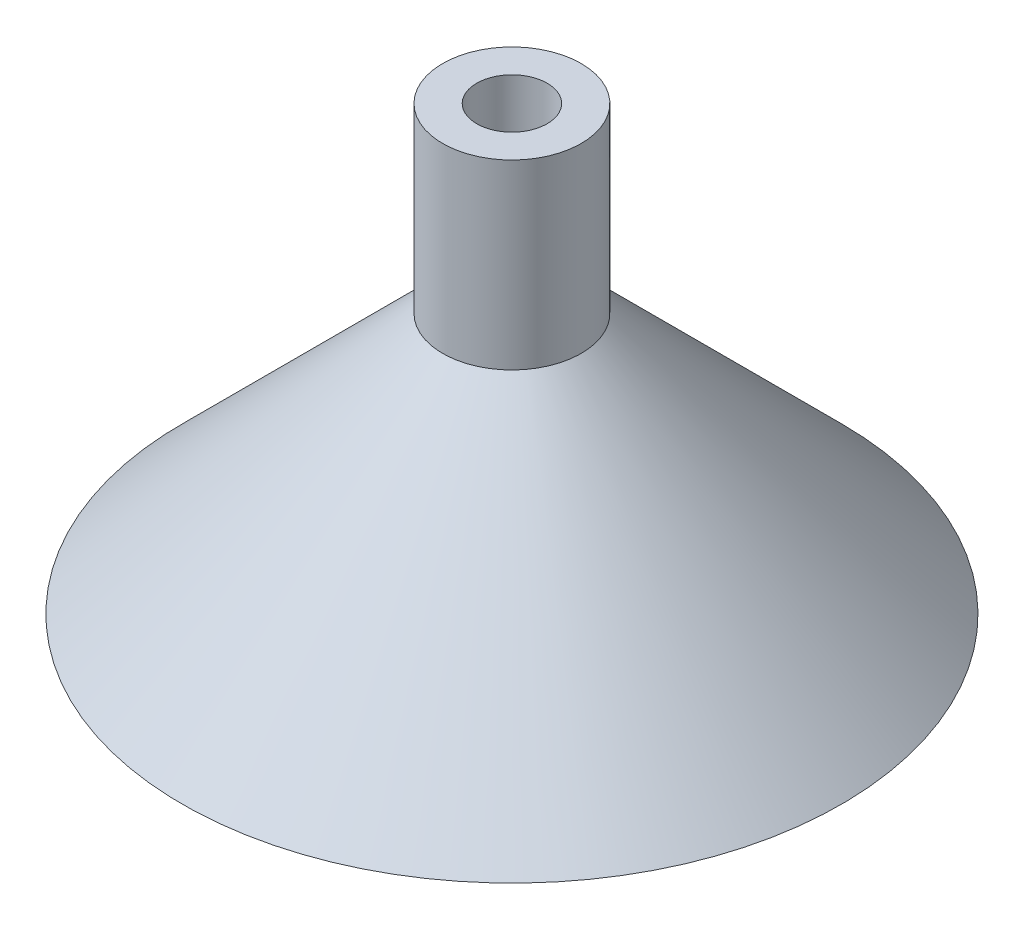
ISO-10303-21;
HEADER;
FILE_DESCRIPTION(('STEP AP214'),'2;1');
FILE_NAME('part.step','',(''),(''),'','','');
FILE_SCHEMA(('AUTOMOTIVE_DESIGN { 1 0 10303 214 1 1 1 1 }'));
ENDSEC;
DATA;
#1=APPLICATION_CONTEXT('core data for automotive mechanical design processes');
#2=APPLICATION_PROTOCOL_DEFINITION('international standard','automotive_design',2000,#1);
#3=PRODUCT_CONTEXT('',#1,'mechanical');
#4=PRODUCT('Part','Part','',(#3));
#5=PRODUCT_RELATED_PRODUCT_CATEGORY('part','',(#4));
#6=PRODUCT_DEFINITION_FORMATION('','',#4);
#7=PRODUCT_DEFINITION_CONTEXT('part definition',#1,'design');
#8=PRODUCT_DEFINITION('design','',#6,#7);
#9=PRODUCT_DEFINITION_SHAPE('','',#8);
#10=(LENGTH_UNIT() NAMED_UNIT(*) SI_UNIT(.MILLI.,.METRE.));
#11=(NAMED_UNIT(*) PLANE_ANGLE_UNIT() SI_UNIT($,.RADIAN.));
#12=(NAMED_UNIT(*) SI_UNIT($,.STERADIAN.) SOLID_ANGLE_UNIT());
#13=UNCERTAINTY_MEASURE_WITH_UNIT(LENGTH_MEASURE(1.E-05),#10,'distance_accuracy_value','');
#14=(GEOMETRIC_REPRESENTATION_CONTEXT(3) GLOBAL_UNCERTAINTY_ASSIGNED_CONTEXT((#13)) GLOBAL_UNIT_ASSIGNED_CONTEXT((#10,
#11,#12)) REPRESENTATION_CONTEXT('',''));
#15=CARTESIAN_POINT('',(0.,0.,0.));
#16=DIRECTION('',(0.,0.,1.));
#17=DIRECTION('',(1.,0.,0.));
#18=AXIS2_PLACEMENT_3D('',#15,#16,#17);
#19=CARTESIAN_POINT('',(0.,0.,0.));
#20=DIRECTION('',(0.,-1.,0.));
#21=DIRECTION('',(0.,0.,-1.));
#22=AXIS2_PLACEMENT_3D('',#19,#20,#21);
#23=CONICAL_SURFACE('',#22,29.,0.785398163397443);
#24=CARTESIAN_POINT('',(0.,22.9040000000002,0.));
#25=DIRECTION('',(0.,-1.,0.));
#26=DIRECTION('',(0.,0.,-1.));
#27=AXIS2_PLACEMENT_3D('',#24,#25,#26);
#28=CIRCLE('',#27,6.096);
#29=CARTESIAN_POINT('',(0.,22.9040000000002,-6.096));
#30=VERTEX_POINT('',#29);
#31=EDGE_CURVE('E53',#30,#30,#28,.T.);
#32=CARTESIAN_POINT('',(0.,0.,0.));
#33=DIRECTION('',(0.,-1.,0.));
#34=DIRECTION('',(0.,0.,-1.));
#35=AXIS2_PLACEMENT_3D('',#32,#33,#34);
#36=CIRCLE('',#35,29.);
#37=CARTESIAN_POINT('',(0.,0.,-29.));
#38=VERTEX_POINT('',#37);
#39=EDGE_CURVE('E10',#38,#38,#36,.T.);
#40=CARTESIAN_POINT('',(0.,22.9040000000002,-6.096));
#41=CARTESIAN_POINT('',(0.,22.6654166666669,-6.33458333333333));
#42=CARTESIAN_POINT('',(0.,22.4268333333336,-6.57316666666666));
#43=CARTESIAN_POINT('',(0.,21.9496666666669,-7.05033333333333));
#44=CARTESIAN_POINT('',(0.,21.7110833333336,-7.28891666666667));
#45=CARTESIAN_POINT('',(0.,21.2339166666669,-7.76608333333333));
#46=CARTESIAN_POINT('',(0.,20.9953333333336,-8.00466666666667));
#47=CARTESIAN_POINT('',(0.,20.5181666666669,-8.48183333333333));
#48=CARTESIAN_POINT('',(0.,20.2795833333335,-8.72041666666667));
#49=CARTESIAN_POINT('',(0.,19.8024166666669,-9.19758333333333));
#50=CARTESIAN_POINT('',(0.,19.5638333333335,-9.43616666666666));
#51=CARTESIAN_POINT('',(0.,19.0866666666669,-9.91333333333333));
#52=CARTESIAN_POINT('',(0.,18.8480833333335,-10.1519166666667));
#53=CARTESIAN_POINT('',(0.,18.3709166666669,-10.6290833333333));
#54=CARTESIAN_POINT('',(0.,18.1323333333335,-10.8676666666667));
#55=CARTESIAN_POINT('',(0.,17.6551666666669,-11.3448333333333));
#56=CARTESIAN_POINT('',(0.,17.4165833333335,-11.5834166666667));
#57=CARTESIAN_POINT('',(0.,16.9394166666668,-12.0605833333333));
#58=CARTESIAN_POINT('',(0.,16.7008333333335,-12.2991666666667));
#59=CARTESIAN_POINT('',(0.,16.2236666666668,-12.7763333333333));
#60=CARTESIAN_POINT('',(0.,15.9850833333335,-13.0149166666667));
#61=CARTESIAN_POINT('',(0.,15.5079166666668,-13.4920833333333));
#62=CARTESIAN_POINT('',(0.,15.2693333333335,-13.7306666666667));
#63=CARTESIAN_POINT('',(0.,14.7921666666668,-14.2078333333333));
#64=CARTESIAN_POINT('',(0.,14.5535833333335,-14.4464166666667));
#65=CARTESIAN_POINT('',(0.,14.0764166666668,-14.9235833333333));
#66=CARTESIAN_POINT('',(0.,13.8378333333335,-15.1621666666667));
#67=CARTESIAN_POINT('',(0.,13.3606666666668,-15.6393333333333));
#68=CARTESIAN_POINT('',(0.,13.1220833333335,-15.8779166666667));
#69=CARTESIAN_POINT('',(0.,12.6449166666668,-16.3550833333333));
#70=CARTESIAN_POINT('',(0.,12.4063333333335,-16.5936666666667));
#71=CARTESIAN_POINT('',(0.,11.9291666666668,-17.0708333333333));
#72=CARTESIAN_POINT('',(0.,11.6905833333335,-17.3094166666667));
#73=CARTESIAN_POINT('',(0.,11.2134166666668,-17.7865833333333));
#74=CARTESIAN_POINT('',(0.,10.9748333333334,-18.0251666666667));
#75=CARTESIAN_POINT('',(0.,10.4976666666668,-18.5023333333333));
#76=CARTESIAN_POINT('',(0.,10.2590833333334,-18.7409166666667));
#77=CARTESIAN_POINT('',(0.,9.78191666666677,-19.2180833333333));
#78=CARTESIAN_POINT('',(0.,9.54333333333343,-19.4566666666667));
#79=CARTESIAN_POINT('',(0.,9.06616666666676,-19.9338333333333));
#80=CARTESIAN_POINT('',(0.,8.82758333333343,-20.1724166666667));
#81=CARTESIAN_POINT('',(0.,8.35041666666675,-20.6495833333333));
#82=CARTESIAN_POINT('',(0.,8.11183333333342,-20.8881666666667));
#83=CARTESIAN_POINT('',(0.,7.63466666666675,-21.3653333333333));
#84=CARTESIAN_POINT('',(0.,7.39608333333341,-21.6039166666667));
#85=CARTESIAN_POINT('',(0.,6.91891666666674,-22.0810833333333));
#86=CARTESIAN_POINT('',(0.,6.6803333333334,-22.3196666666667));
#87=CARTESIAN_POINT('',(0.,6.20316666666673,-22.7968333333333));
#88=CARTESIAN_POINT('',(0.,5.96458333333339,-23.0354166666667));
#89=CARTESIAN_POINT('',(0.,5.48741666666672,-23.5125833333333));
#90=CARTESIAN_POINT('',(0.,5.24883333333339,-23.7511666666667));
#91=CARTESIAN_POINT('',(0.,4.77166666666671,-24.2283333333333));
#92=CARTESIAN_POINT('',(0.,4.53308333333338,-24.4669166666667));
#93=CARTESIAN_POINT('',(0.,4.05591666666671,-24.9440833333333));
#94=CARTESIAN_POINT('',(0.,3.81733333333337,-25.1826666666667));
#95=CARTESIAN_POINT('',(0.,3.3401666666667,-25.6598333333333));
#96=CARTESIAN_POINT('',(0.,3.10158333333337,-25.8984166666667));
#97=CARTESIAN_POINT('',(0.,2.62441666666669,-26.3755833333333));
#98=CARTESIAN_POINT('',(0.,2.38583333333336,-26.6141666666667));
#99=CARTESIAN_POINT('',(0.,1.90866666666669,-27.0913333333333));
#100=CARTESIAN_POINT('',(0.,1.67008333333335,-27.3299166666667));
#101=CARTESIAN_POINT('',(0.,1.19291666666668,-27.8070833333333));
#102=CARTESIAN_POINT('',(0.,0.954333333333342,-28.0456666666667));
#103=CARTESIAN_POINT('',(0.,0.47716666666667,-28.5228333333333));
#104=CARTESIAN_POINT('',(0.,0.238583333333335,-28.7614166666667));
#105=CARTESIAN_POINT('',(0.,0.,-29.));
#106=B_SPLINE_CURVE_WITH_KNOTS('',3,(#40,#41,#42,#43,#44,#45,#46,#47,#48,#49,#50,#51,#52,#53,
#54,#55,#56,#57,#58,#59,#60,#61,#62,#63,#64,#65,#66,#67,#68,#69,#70,#71,#72,#73,#74,#75,#76,#77,
#78,#79,#80,#81,#82,#83,#84,#85,#86,#87,#88,#89,#90,#91,#92,#93,#94,#95,#96,#97,#98,#99,#100,
#101,#102,#103,#104,#105),.UNSPECIFIED.,.F.,.F.,(4,2,2,2,2,2,2,2,2,2,2,2,2,2,2,2,2,2,2,2,2,2,2,
2,2,2,2,2,2,2,2,2,4),(0.,1.01222335726855,2.0244467145371,3.03667007180565,4.0488934290742,
5.06111678634274,6.07334014361129,7.08556350087984,8.09778685814839,9.11001021541694,
10.1222335726855,11.134456929954,12.1466802872226,13.1589036444911,14.1711270017597,
15.1833503590282,16.1955737162968,17.2077970735653,18.2200204308339,19.2322437881024,
20.244467145371,21.2566905026395,22.2689138599081,23.2811372171766,24.2933605744451,
25.3055839317137,26.3178072889822,27.3300306462508,28.3422540035193,29.3544773607879,
30.3667007180564,31.378924075325,32.3911474325935),.UNSPECIFIED.);
#107=EDGE_CURVE('BSEAM31',#30,#38,#106,.T.);
#108=ORIENTED_EDGE('',*,*,#31,.T.);
#109=ORIENTED_EDGE('',*,*,#39,.F.);
#110=ORIENTED_EDGE('',*,*,#107,.T.);
#111=ORIENTED_EDGE('',*,*,#107,.F.);
#112=EDGE_LOOP('',(#108,#110,#109,#111));
#113=FACE_BOUND('',#112,.T.);
#114=ADVANCED_FACE('F31',(#113),#23,.T.);
#115=CARTESIAN_POINT('',(25.32304473783,0.,0.));
#116=DIRECTION('',(0.,-1.,0.));
#117=DIRECTION('',(0.,0.,-1.));
#118=AXIS2_PLACEMENT_3D('',#115,#116,#117);
#119=PLANE('',#118);
#120=ORIENTED_EDGE('',*,*,#39,.T.);
#121=EDGE_LOOP('',(#120));
#122=FACE_BOUND('',#121,.T.);
#123=CARTESIAN_POINT('',(0.,0.,0.));
#124=DIRECTION('',(0.,-1.,0.));
#125=DIRECTION('',(0.,0.,-1.));
#126=AXIS2_PLACEMENT_3D('',#123,#124,#125);
#127=CIRCLE('',#126,25.32304473783);
#128=CARTESIAN_POINT('',(0.,0.,-25.32304473783));
#129=VERTEX_POINT('',#128);
#130=EDGE_CURVE('E37',#129,#129,#127,.T.);
#131=ORIENTED_EDGE('',*,*,#130,.F.);
#132=EDGE_LOOP('',(#131));
#133=FACE_BOUND('',#132,.T.);
#134=ADVANCED_FACE('F71',(#122,#133),#119,.T.);
#135=CARTESIAN_POINT('',(0.,22.2270447378302,0.));
#136=DIRECTION('',(0.,-1.,0.));
#137=DIRECTION('',(0.,0.,-1.));
#138=AXIS2_PLACEMENT_3D('',#135,#136,#137);
#139=CONICAL_SURFACE('',#138,3.096,0.785398163397443);
#140=CARTESIAN_POINT('',(0.,22.2270447378302,0.));
#141=DIRECTION('',(0.,-1.,0.));
#142=DIRECTION('',(0.,0.,-1.));
#143=AXIS2_PLACEMENT_3D('',#140,#141,#142);
#144=CIRCLE('',#143,3.096);
#145=CARTESIAN_POINT('',(0.,22.2270447378302,-3.096));
#146=VERTEX_POINT('',#145);
#147=EDGE_CURVE('E41',#146,#146,#144,.T.);
#148=CARTESIAN_POINT('',(0.,0.,-25.32304473783));
#149=CARTESIAN_POINT('',(0.,0.231531716019065,-25.0915130218109));
#150=CARTESIAN_POINT('',(0.,0.463063432038129,-24.8599813057919));
#151=CARTESIAN_POINT('',(0.,0.926126864076259,-24.3969178737537));
#152=CARTESIAN_POINT('',(0.,1.15765858009532,-24.1653861577347));
#153=CARTESIAN_POINT('',(0.,1.62072201213345,-23.7023227256965));
#154=CARTESIAN_POINT('',(0.,1.85225372815252,-23.4707910096775));
#155=CARTESIAN_POINT('',(0.,2.31531716019065,-23.0077275776394));
#156=CARTESIAN_POINT('',(0.,2.54684887620971,-22.7761958616203));
#157=CARTESIAN_POINT('',(0.,3.00991230824784,-22.3131324295822));
#158=CARTESIAN_POINT('',(0.,3.2414440242669,-22.0816007135631));
#159=CARTESIAN_POINT('',(0.,3.70450745630503,-21.618537281525));
#160=CARTESIAN_POINT('',(0.,3.9360391723241,-21.3870055655059));
#161=CARTESIAN_POINT('',(0.,4.39910260436223,-20.9239421334678));
#162=CARTESIAN_POINT('',(0.,4.63063432038129,-20.6924104174487));
#163=CARTESIAN_POINT('',(0.,5.09369775241942,-20.2293469854106));
#164=CARTESIAN_POINT('',(0.,5.32522946843849,-19.9978152693915));
#165=CARTESIAN_POINT('',(0.,5.78829290047661,-19.5347518373534));
#166=CARTESIAN_POINT('',(0.,6.01982461649568,-19.3032201213344));
#167=CARTESIAN_POINT('',(0.,6.48288804853381,-18.8401566892962));
#168=CARTESIAN_POINT('',(0.,6.71441976455287,-18.6086249732772));
#169=CARTESIAN_POINT('',(0.,7.177483196591,-18.145561541239));
#170=CARTESIAN_POINT('',(0.,7.40901491261007,-17.91402982522));
#171=CARTESIAN_POINT('',(0.,7.8720783446482,-17.4509663931819));
#172=CARTESIAN_POINT('',(0.,8.10361006066726,-17.2194346771628));
#173=CARTESIAN_POINT('',(0.,8.56667349270539,-16.7563712451247));
#174=CARTESIAN_POINT('',(0.,8.79820520872445,-16.5248395291056));
#175=CARTESIAN_POINT('',(0.,9.26126864076258,-16.0617760970675));
#176=CARTESIAN_POINT('',(0.,9.49280035678165,-15.8302443810484));
#177=CARTESIAN_POINT('',(0.,9.95586378881978,-15.3671809490103));
#178=CARTESIAN_POINT('',(0.,10.1873955048388,-15.1356492329912));
#179=CARTESIAN_POINT('',(0.,10.650458936877,-14.6725858009531));
#180=CARTESIAN_POINT('',(0.,10.881990652896,-14.4410540849341));
#181=CARTESIAN_POINT('',(0.,11.3450540849342,-13.9779906528959));
#182=CARTESIAN_POINT('',(0.,11.5765858009532,-13.7464589368769));
#183=CARTESIAN_POINT('',(0.,12.0396492329914,-13.2833955048387));
#184=CARTESIAN_POINT('',(0.,12.2711809490104,-13.0518637888197));
#185=CARTESIAN_POINT('',(0.,12.7342443810486,-12.5888003567816));
#186=CARTESIAN_POINT('',(0.,12.9657760970676,-12.3572686407625));
#187=CARTESIAN_POINT('',(0.,13.4288395291057,-11.8942052087244));
#188=CARTESIAN_POINT('',(0.,13.6603712451248,-11.6626734927053));
#189=CARTESIAN_POINT('',(0.,14.1234346771629,-11.1996100606672));
#190=CARTESIAN_POINT('',(0.,14.354966393182,-10.9680783446481));
#191=CARTESIAN_POINT('',(0.,14.8180298252201,-10.50501491261));
#192=CARTESIAN_POINT('',(0.,15.0495615412392,-10.2734831965909));
#193=CARTESIAN_POINT('',(0.,15.5126249732773,-9.81041976455281));
#194=CARTESIAN_POINT('',(0.,15.7441566892964,-9.57888804853375));
#195=CARTESIAN_POINT('',(0.,16.2072201213345,-9.11582461649562));
#196=CARTESIAN_POINT('',(0.,16.4387518373536,-8.88429290047656));
#197=CARTESIAN_POINT('',(0.,16.9018152693917,-8.42122946843844));
#198=CARTESIAN_POINT('',(0.,17.1333469854108,-8.18969775241937));
#199=CARTESIAN_POINT('',(0.,17.5964104174489,-7.72663432038125));
#200=CARTESIAN_POINT('',(0.,17.827942133468,-7.49510260436218));
#201=CARTESIAN_POINT('',(0.,18.2910055655061,-7.03203917232406));
#202=CARTESIAN_POINT('',(0.,18.5225372815252,-6.800507456305));
#203=CARTESIAN_POINT('',(0.,18.9856007135633,-6.33744402426687));
#204=CARTESIAN_POINT('',(0.,19.2171324295824,-6.10591230824781));
#205=CARTESIAN_POINT('',(0.,19.6801958616205,-5.64284887620969));
#206=CARTESIAN_POINT('',(0.,19.9117275776396,-5.41131716019063));
#207=CARTESIAN_POINT('',(0.,20.3747910096777,-4.9482537281525));
#208=CARTESIAN_POINT('',(0.,20.6063227256967,-4.71672201213344));
#209=CARTESIAN_POINT('',(0.,21.0693861577349,-4.25365858009531));
#210=CARTESIAN_POINT('',(0.,21.3009178737539,-4.02212686407625));
#211=CARTESIAN_POINT('',(0.,21.7639813057921,-3.55906343203813));
#212=CARTESIAN_POINT('',(0.,21.9955130218111,-3.32753171601906));
#213=CARTESIAN_POINT('',(0.,22.2270447378302,-3.096));
#214=B_SPLINE_CURVE_WITH_KNOTS('',3,(#148,#149,#150,#151,#152,#153,#154,#155,#156,#157,#158,
#159,#160,#161,#162,#163,#164,#165,#166,#167,#168,#169,#170,#171,#172,#173,#174,#175,#176,#177,
#178,#179,#180,#181,#182,#183,#184,#185,#186,#187,#188,#189,#190,#191,#192,#193,#194,#195,#196,
#197,#198,#199,#200,#201,#202,#203,#204,#205,#206,#207,#208,#209,#210,#211,#212,#213),
.UNSPECIFIED.,.F.,.F.,(4,2,2,2,2,2,2,2,2,2,2,2,2,2,2,2,2,2,2,2,2,2,2,2,2,2,2,2,2,2,2,2,4),(0.,
0.982305878741027,1.96461175748205,2.94691763622308,3.92922351496411,4.91152939370513,
5.89383527244616,6.87614115118719,7.85844702992821,8.84075290866924,9.82305878741026,
10.8053646661513,11.7876705448923,12.7699764236333,13.7522823023744,14.7345881811154,
15.7168940598564,16.6991999385975,17.6815058173385,18.6638116960795,19.6461175748205,
20.6284234535616,21.6107293323026,22.5930352110436,23.5753410897846,24.5576469685257,
25.5399528472667,26.5222587260077,27.5045646047487,28.4868704834898,29.4691763622308,
30.4514822409718,31.4337881197128),.UNSPECIFIED.);
#215=EDGE_CURVE('BSEAM75',#129,#146,#214,.T.);
#216=ORIENTED_EDGE('',*,*,#130,.T.);
#217=ORIENTED_EDGE('',*,*,#147,.F.);
#218=ORIENTED_EDGE('',*,*,#215,.T.);
#219=ORIENTED_EDGE('',*,*,#215,.F.);
#220=EDGE_LOOP('',(#216,#218,#217,#219));
#221=FACE_BOUND('',#220,.T.);
#222=ADVANCED_FACE('F75',(#221),#139,.F.);
#223=CARTESIAN_POINT('',(0.,0.,0.));
#224=DIRECTION('',(0.,-1.,0.));
#225=DIRECTION('',(0.,0.,-1.));
#226=AXIS2_PLACEMENT_3D('',#223,#224,#225);
#227=CYLINDRICAL_SURFACE('',#226,3.096);
#228=ORIENTED_EDGE('',*,*,#147,.T.);
#229=EDGE_LOOP('',(#228));
#230=FACE_BOUND('',#229,.T.);
#231=CARTESIAN_POINT('',(0.,38.9040000000002,0.));
#232=DIRECTION('',(0.,-1.,0.));
#233=DIRECTION('',(0.,0.,-1.));
#234=AXIS2_PLACEMENT_3D('',#231,#232,#233);
#235=CIRCLE('',#234,3.096);
#236=CARTESIAN_POINT('',(0.,38.9040000000002,-3.096));
#237=VERTEX_POINT('',#236);
#238=EDGE_CURVE('E45',#237,#237,#235,.T.);
#239=ORIENTED_EDGE('',*,*,#238,.F.);
#240=EDGE_LOOP('',(#239));
#241=FACE_BOUND('',#240,.T.);
#242=ADVANCED_FACE('F67',(#230,#241),#227,.F.);
#243=CARTESIAN_POINT('',(6.096,38.9040000000002,0.));
#244=DIRECTION('',(0.,1.,0.));
#245=DIRECTION('',(0.,0.,1.));
#246=AXIS2_PLACEMENT_3D('',#243,#244,#245);
#247=PLANE('',#246);
#248=ORIENTED_EDGE('',*,*,#238,.T.);
#249=EDGE_LOOP('',(#248));
#250=FACE_BOUND('',#249,.T.);
#251=CARTESIAN_POINT('',(0.,38.9040000000002,0.));
#252=DIRECTION('',(0.,-1.,0.));
#253=DIRECTION('',(0.,0.,-1.));
#254=AXIS2_PLACEMENT_3D('',#251,#252,#253);
#255=CIRCLE('',#254,6.096);
#256=CARTESIAN_POINT('',(0.,38.9040000000002,-6.096));
#257=VERTEX_POINT('',#256);
#258=EDGE_CURVE('E50',#257,#257,#255,.T.);
#259=ORIENTED_EDGE('',*,*,#258,.F.);
#260=EDGE_LOOP('',(#259));
#261=FACE_BOUND('',#260,.T.);
#262=ADVANCED_FACE('F61',(#250,#261),#247,.T.);
#263=CARTESIAN_POINT('',(0.,0.,0.));
#264=DIRECTION('',(0.,-1.,0.));
#265=DIRECTION('',(0.,0.,-1.));
#266=AXIS2_PLACEMENT_3D('',#263,#264,#265);
#267=CYLINDRICAL_SURFACE('',#266,6.096);
#268=ORIENTED_EDGE('',*,*,#258,.T.);
#269=EDGE_LOOP('',(#268));
#270=FACE_BOUND('',#269,.T.);
#271=ORIENTED_EDGE('',*,*,#31,.F.);
#272=EDGE_LOOP('',(#271));
#273=FACE_BOUND('',#272,.T.);
#274=ADVANCED_FACE('F59',(#270,#273),#267,.T.);
#275=CLOSED_SHELL('',(#114,#134,#222,#242,#262,#274));
#276=MANIFOLD_SOLID_BREP('B2',#275);
#277=ADVANCED_BREP_SHAPE_REPRESENTATION('',(#18,#276),#14);
#278=SHAPE_DEFINITION_REPRESENTATION(#9,#277);
ENDSEC;
END-ISO-10303-21;
